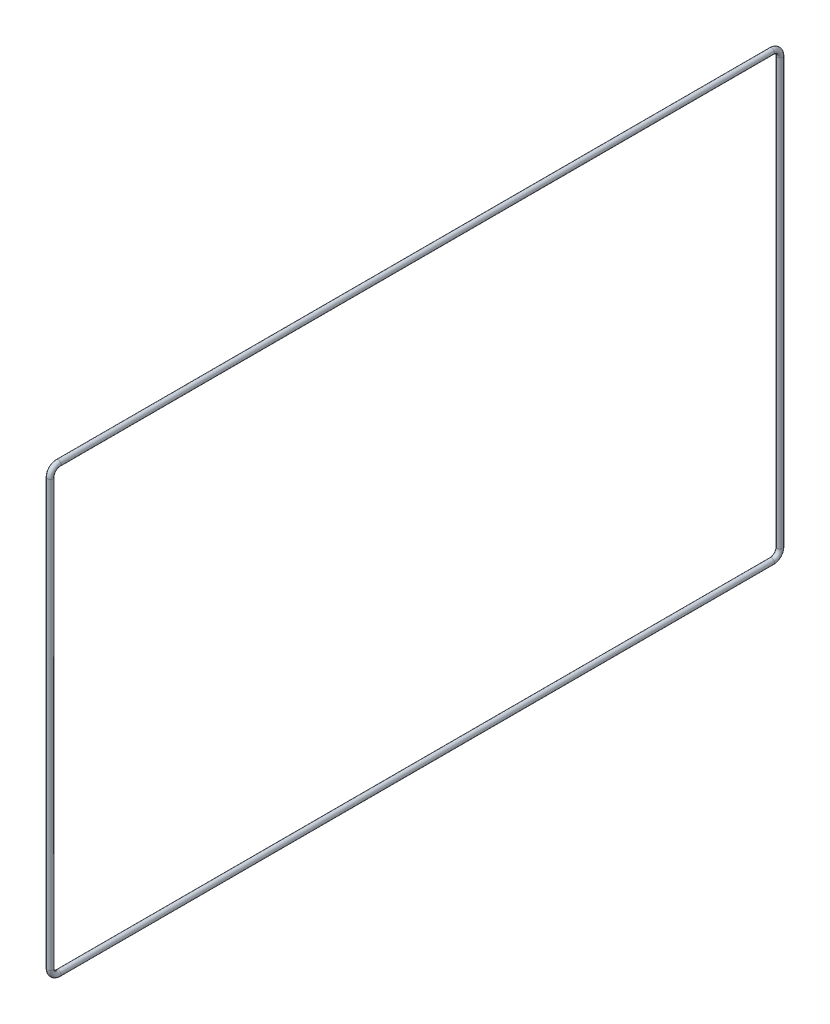
ISO-10303-21;
HEADER;
FILE_DESCRIPTION(('STEP AP214'),'2;1');
FILE_NAME('part.step','',(''),(''),'','','');
FILE_SCHEMA(('AUTOMOTIVE_DESIGN { 1 0 10303 214 1 1 1 1 }'));
ENDSEC;
DATA;
#1=APPLICATION_CONTEXT('core data for automotive mechanical design processes');
#2=APPLICATION_PROTOCOL_DEFINITION('international standard','automotive_design',2000,#1);
#3=PRODUCT_CONTEXT('',#1,'mechanical');
#4=PRODUCT('Part','Part','',(#3));
#5=PRODUCT_RELATED_PRODUCT_CATEGORY('part','',(#4));
#6=PRODUCT_DEFINITION_FORMATION('','',#4);
#7=PRODUCT_DEFINITION_CONTEXT('part definition',#1,'design');
#8=PRODUCT_DEFINITION('design','',#6,#7);
#9=PRODUCT_DEFINITION_SHAPE('','',#8);
#10=(LENGTH_UNIT() NAMED_UNIT(*) SI_UNIT(.MILLI.,.METRE.));
#11=(NAMED_UNIT(*) PLANE_ANGLE_UNIT() SI_UNIT($,.RADIAN.));
#12=(NAMED_UNIT(*) SI_UNIT($,.STERADIAN.) SOLID_ANGLE_UNIT());
#13=UNCERTAINTY_MEASURE_WITH_UNIT(LENGTH_MEASURE(1.E-05),#10,'distance_accuracy_value','');
#14=(GEOMETRIC_REPRESENTATION_CONTEXT(3) GLOBAL_UNCERTAINTY_ASSIGNED_CONTEXT((#13)) GLOBAL_UNIT_ASSIGNED_CONTEXT((#10,
#11,#12)) REPRESENTATION_CONTEXT('',''));
#15=CARTESIAN_POINT('',(0.,0.,0.));
#16=DIRECTION('',(0.,0.,1.));
#17=DIRECTION('',(1.,0.,0.));
#18=AXIS2_PLACEMENT_3D('',#15,#16,#17);
#19=CARTESIAN_POINT('',(0.,78.0992995391705,137.949474654378));
#20=DIRECTION('',(1.,0.,0.));
#21=DIRECTION('',(0.,0.,-1.));
#22=AXIS2_PLACEMENT_3D('',#19,#20,#21);
#23=TOROIDAL_SURFACE('',#22,3.00000000000003,1.);
#24=CARTESIAN_POINT('',(0.,81.0992995391705,137.949474654378));
#25=DIRECTION('',(0.,0.,1.));
#26=DIRECTION('',(0.,-1.,0.));
#27=AXIS2_PLACEMENT_3D('',#24,#25,#26);
#28=CIRCLE('',#27,1.);
#29=CARTESIAN_POINT('',(0.,82.0992995391705,137.949474654378));
#30=VERTEX_POINT('',#29);
#31=EDGE_CURVE('E12',#30,#30,#28,.T.);
#32=CARTESIAN_POINT('',(0.,78.0992995391705,140.949474654378));
#33=DIRECTION('',(0.,-1.,0.));
#34=DIRECTION('',(0.,0.,-1.));
#35=AXIS2_PLACEMENT_3D('',#32,#33,#34);
#36=CIRCLE('',#35,1.);
#37=CARTESIAN_POINT('',(0.,78.0992995391705,141.949474654378));
#38=VERTEX_POINT('',#37);
#39=EDGE_CURVE('E66',#38,#38,#36,.T.);
#40=CARTESIAN_POINT('',(0.,78.0992995391705,137.949474654378));
#41=DIRECTION('',(1.,0.,0.));
#42=DIRECTION('',(0.,0.,-1.));
#43=AXIS2_PLACEMENT_3D('',#40,#41,#42);
#44=CIRCLE('',#43,4.00000000000003);
#45=EDGE_CURVE('',#30,#38,#44,.T.);
#46=ORIENTED_EDGE('',*,*,#31,.T.);
#47=ORIENTED_EDGE('',*,*,#39,.F.);
#48=ORIENTED_EDGE('',*,*,#45,.T.);
#49=ORIENTED_EDGE('',*,*,#45,.F.);
#50=EDGE_LOOP('',(#46,#48,#47,#49));
#51=FACE_BOUND('',#50,.T.);
#52=ADVANCED_FACE('F49',(#51),#23,.T.);
#53=CARTESIAN_POINT('',(0.,81.0992995391705,-122.050525345622));
#54=DIRECTION('',(0.,0.,1.));
#55=DIRECTION('',(1.,0.,0.));
#56=AXIS2_PLACEMENT_3D('',#53,#54,#55);
#57=CYLINDRICAL_SURFACE('',#56,1.);
#58=ORIENTED_EDGE('',*,*,#31,.F.);
#59=EDGE_LOOP('',(#58));
#60=FACE_BOUND('',#59,.T.);
#61=CARTESIAN_POINT('',(0.,81.0992995391705,-122.050525345622));
#62=DIRECTION('',(0.,0.,1.));
#63=DIRECTION('',(0.,-1.,0.));
#64=AXIS2_PLACEMENT_3D('',#61,#62,#63);
#65=CIRCLE('',#64,1.);
#66=CARTESIAN_POINT('',(0.,82.0992995391705,-122.050525345622));
#67=VERTEX_POINT('',#66);
#68=EDGE_CURVE('E59',#67,#67,#65,.T.);
#69=ORIENTED_EDGE('',*,*,#68,.T.);
#70=EDGE_LOOP('',(#69));
#71=FACE_BOUND('',#70,.T.);
#72=ADVANCED_FACE('F92',(#60,#71),#57,.T.);
#73=CARTESIAN_POINT('',(0.,78.0992995391705,-122.050525345622));
#74=DIRECTION('',(1.,0.,0.));
#75=DIRECTION('',(0.,0.,-1.));
#76=AXIS2_PLACEMENT_3D('',#73,#74,#75);
#77=TOROIDAL_SURFACE('',#76,3.00000000000002,1.);
#78=CARTESIAN_POINT('',(0.,78.0992995391705,-125.050525345622));
#79=DIRECTION('',(0.,1.,0.));
#80=DIRECTION('',(0.,0.,1.));
#81=AXIS2_PLACEMENT_3D('',#78,#79,#80);
#82=CIRCLE('',#81,1.);
#83=CARTESIAN_POINT('',(0.,78.0992995391705,-126.050525345622));
#84=VERTEX_POINT('',#83);
#85=EDGE_CURVE('E65',#84,#84,#82,.T.);
#86=CARTESIAN_POINT('',(0.,78.0992995391705,-122.050525345622));
#87=DIRECTION('',(1.,0.,0.));
#88=DIRECTION('',(0.,0.,-1.));
#89=AXIS2_PLACEMENT_3D('',#86,#87,#88);
#90=CIRCLE('',#89,4.00000000000002);
#91=EDGE_CURVE('',#84,#67,#90,.T.);
#92=ORIENTED_EDGE('',*,*,#85,.T.);
#93=ORIENTED_EDGE('',*,*,#68,.F.);
#94=ORIENTED_EDGE('',*,*,#91,.T.);
#95=ORIENTED_EDGE('',*,*,#91,.F.);
#96=EDGE_LOOP('',(#92,#94,#93,#95));
#97=FACE_BOUND('',#96,.T.);
#98=ADVANCED_FACE('F101',(#97),#77,.T.);
#99=CARTESIAN_POINT('',(0.,-76.9007004608295,-125.050525345622));
#100=DIRECTION('',(0.,1.,0.));
#101=DIRECTION('',(0.,0.,1.));
#102=AXIS2_PLACEMENT_3D('',#99,#100,#101);
#103=CYLINDRICAL_SURFACE('',#102,1.);
#104=ORIENTED_EDGE('',*,*,#85,.F.);
#105=EDGE_LOOP('',(#104));
#106=FACE_BOUND('',#105,.T.);
#107=CARTESIAN_POINT('',(0.,-76.9007004608295,-125.050525345622));
#108=DIRECTION('',(0.,1.,0.));
#109=DIRECTION('',(0.,0.,1.));
#110=AXIS2_PLACEMENT_3D('',#107,#108,#109);
#111=CIRCLE('',#110,1.);
#112=CARTESIAN_POINT('',(0.,-76.9007004608295,-126.050525345622));
#113=VERTEX_POINT('',#112);
#114=EDGE_CURVE('E71',#113,#113,#111,.T.);
#115=ORIENTED_EDGE('',*,*,#114,.T.);
#116=EDGE_LOOP('',(#115));
#117=FACE_BOUND('',#116,.T.);
#118=ADVANCED_FACE('F110',(#106,#117),#103,.T.);
#119=CARTESIAN_POINT('',(0.,-76.9007004608295,-122.050525345622));
#120=DIRECTION('',(1.,0.,0.));
#121=DIRECTION('',(0.,0.,-1.));
#122=AXIS2_PLACEMENT_3D('',#119,#120,#121);
#123=TOROIDAL_SURFACE('',#122,3.,1.);
#124=CARTESIAN_POINT('',(0.,-79.9007004608295,-122.050525345622));
#125=DIRECTION('',(0.,0.,-1.));
#126=DIRECTION('',(0.,1.,0.));
#127=AXIS2_PLACEMENT_3D('',#124,#125,#126);
#128=CIRCLE('',#127,1.);
#129=CARTESIAN_POINT('',(0.,-80.9007004608295,-122.050525345622));
#130=VERTEX_POINT('',#129);
#131=EDGE_CURVE('E77',#130,#130,#128,.T.);
#132=CARTESIAN_POINT('',(0.,-76.9007004608295,-122.050525345622));
#133=DIRECTION('',(1.,0.,0.));
#134=DIRECTION('',(0.,0.,-1.));
#135=AXIS2_PLACEMENT_3D('',#132,#133,#134);
#136=CIRCLE('',#135,4.);
#137=EDGE_CURVE('',#130,#113,#136,.T.);
#138=ORIENTED_EDGE('',*,*,#131,.T.);
#139=ORIENTED_EDGE('',*,*,#114,.F.);
#140=ORIENTED_EDGE('',*,*,#137,.T.);
#141=ORIENTED_EDGE('',*,*,#137,.F.);
#142=EDGE_LOOP('',(#138,#140,#139,#141));
#143=FACE_BOUND('',#142,.T.);
#144=ADVANCED_FACE('F112',(#143),#123,.T.);
#145=CARTESIAN_POINT('',(0.,-79.9007004608295,122.949474654378));
#146=DIRECTION('',(0.,0.,-1.));
#147=DIRECTION('',(-1.,0.,0.));
#148=AXIS2_PLACEMENT_3D('',#145,#146,#147);
#149=CYLINDRICAL_SURFACE('',#148,1.);
#150=ORIENTED_EDGE('',*,*,#131,.F.);
#151=EDGE_LOOP('',(#150));
#152=FACE_BOUND('',#151,.T.);
#153=CARTESIAN_POINT('',(0.,-79.9007004608295,137.949474654378));
#154=DIRECTION('',(0.,0.,-1.));
#155=DIRECTION('',(0.,1.,0.));
#156=AXIS2_PLACEMENT_3D('',#153,#154,#155);
#157=CIRCLE('',#156,1.);
#158=CARTESIAN_POINT('',(0.,-80.9007004608295,137.949474654378));
#159=VERTEX_POINT('',#158);
#160=EDGE_CURVE('E53',#159,#159,#157,.T.);
#161=ORIENTED_EDGE('',*,*,#160,.T.);
#162=EDGE_LOOP('',(#161));
#163=FACE_BOUND('',#162,.T.);
#164=ADVANCED_FACE('F81',(#152,#163),#149,.T.);
#165=CARTESIAN_POINT('',(0.,-76.9007004608295,137.949474654378));
#166=DIRECTION('',(1.,0.,0.));
#167=DIRECTION('',(0.,0.,-1.));
#168=AXIS2_PLACEMENT_3D('',#165,#166,#167);
#169=TOROIDAL_SURFACE('',#168,3.00000000000002,1.);
#170=CARTESIAN_POINT('',(0.,-76.9007004608295,140.949474654378));
#171=DIRECTION('',(0.,-1.,0.));
#172=DIRECTION('',(0.,0.,-1.));
#173=AXIS2_PLACEMENT_3D('',#170,#171,#172);
#174=CIRCLE('',#173,1.);
#175=CARTESIAN_POINT('',(0.,-76.9007004608295,141.949474654378));
#176=VERTEX_POINT('',#175);
#177=EDGE_CURVE('E63',#176,#176,#174,.T.);
#178=CARTESIAN_POINT('',(0.,-76.9007004608295,137.949474654378));
#179=DIRECTION('',(1.,0.,0.));
#180=DIRECTION('',(0.,0.,-1.));
#181=AXIS2_PLACEMENT_3D('',#178,#179,#180);
#182=CIRCLE('',#181,4.00000000000002);
#183=EDGE_CURVE('',#176,#159,#182,.T.);
#184=ORIENTED_EDGE('',*,*,#177,.T.);
#185=ORIENTED_EDGE('',*,*,#160,.F.);
#186=ORIENTED_EDGE('',*,*,#183,.T.);
#187=ORIENTED_EDGE('',*,*,#183,.F.);
#188=EDGE_LOOP('',(#184,#186,#185,#187));
#189=FACE_BOUND('',#188,.T.);
#190=ADVANCED_FACE('F55',(#189),#169,.T.);
#191=CARTESIAN_POINT('',(0.,78.0992995391705,140.949474654378));
#192=DIRECTION('',(0.,-1.,0.));
#193=DIRECTION('',(0.,0.,-1.));
#194=AXIS2_PLACEMENT_3D('',#191,#192,#193);
#195=CYLINDRICAL_SURFACE('',#194,1.);
#196=ORIENTED_EDGE('',*,*,#177,.F.);
#197=EDGE_LOOP('',(#196));
#198=FACE_BOUND('',#197,.T.);
#199=ORIENTED_EDGE('',*,*,#39,.T.);
#200=EDGE_LOOP('',(#199));
#201=FACE_BOUND('',#200,.T.);
#202=ADVANCED_FACE('F87',(#198,#201),#195,.T.);
#203=CLOSED_SHELL('',(#52,#72,#98,#118,#144,#164,#190,#202));
#204=MANIFOLD_SOLID_BREP('B2',#203);
#205=ADVANCED_BREP_SHAPE_REPRESENTATION('',(#18,#204),#14);
#206=SHAPE_DEFINITION_REPRESENTATION(#9,#205);
ENDSEC;
END-ISO-10303-21;
